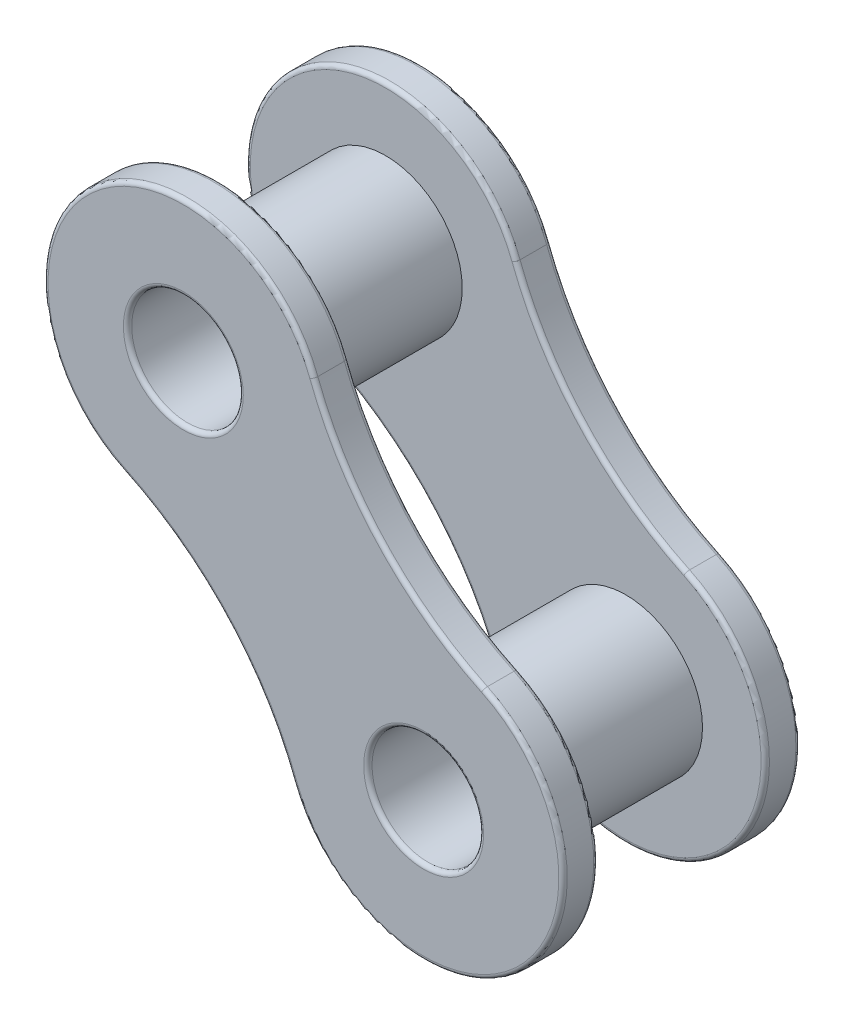
ISO-10303-21;
HEADER;
FILE_DESCRIPTION(('STEP AP214'),'2;1');
FILE_NAME('part.step','',(''),(''),'','','');
FILE_SCHEMA(('AUTOMOTIVE_DESIGN { 1 0 10303 214 1 1 1 1 }'));
ENDSEC;
DATA;
#1=APPLICATION_CONTEXT('core data for automotive mechanical design processes');
#2=APPLICATION_PROTOCOL_DEFINITION('international standard','automotive_design',2000,#1);
#3=PRODUCT_CONTEXT('',#1,'mechanical');
#4=PRODUCT('Part','Part','',(#3));
#5=PRODUCT_RELATED_PRODUCT_CATEGORY('part','',(#4));
#6=PRODUCT_DEFINITION_FORMATION('','',#4);
#7=PRODUCT_DEFINITION_CONTEXT('part definition',#1,'design');
#8=PRODUCT_DEFINITION('design','',#6,#7);
#9=PRODUCT_DEFINITION_SHAPE('','',#8);
#10=(LENGTH_UNIT() NAMED_UNIT(*) SI_UNIT(.MILLI.,.METRE.));
#11=(NAMED_UNIT(*) PLANE_ANGLE_UNIT() SI_UNIT($,.RADIAN.));
#12=(NAMED_UNIT(*) SI_UNIT($,.STERADIAN.) SOLID_ANGLE_UNIT());
#13=UNCERTAINTY_MEASURE_WITH_UNIT(LENGTH_MEASURE(1.E-05),#10,'distance_accuracy_value','');
#14=(GEOMETRIC_REPRESENTATION_CONTEXT(3) GLOBAL_UNCERTAINTY_ASSIGNED_CONTEXT((#13)) GLOBAL_UNIT_ASSIGNED_CONTEXT((#10,
#11,#12)) REPRESENTATION_CONTEXT('',''));
#15=CARTESIAN_POINT('',(0.,0.,0.));
#16=DIRECTION('',(0.,0.,1.));
#17=DIRECTION('',(1.,0.,0.));
#18=AXIS2_PLACEMENT_3D('',#15,#16,#17);
#19=CARTESIAN_POINT('',(30.571434610087,-17.7693676281133,-3.));
#20=DIRECTION('',(0.,0.,1.));
#21=DIRECTION('',(1.,0.,0.));
#22=AXIS2_PLACEMENT_3D('',#19,#20,#21);
#23=CYLINDRICAL_SURFACE('',#22,2.75);
#24=CARTESIAN_POINT('',(30.571434610087,-17.7693676281133,-3.));
#25=DIRECTION('',(0.,0.,1.));
#26=DIRECTION('',(1.,0.,0.));
#27=AXIS2_PLACEMENT_3D('',#24,#25,#26);
#28=CIRCLE('',#27,2.75);
#29=CARTESIAN_POINT('',(33.321434610087,-17.7693676281133,-3.));
#30=VERTEX_POINT('',#29);
#31=EDGE_CURVE('E325',#30,#30,#28,.T.);
#32=ORIENTED_EDGE('',*,*,#31,.T.);
#33=EDGE_LOOP('',(#32));
#34=FACE_BOUND('',#33,.T.);
#35=CARTESIAN_POINT('',(30.571434610087,-17.7693676281133,3.));
#36=DIRECTION('',(0.,0.,1.));
#37=DIRECTION('',(1.,0.,0.));
#38=AXIS2_PLACEMENT_3D('',#35,#36,#37);
#39=CIRCLE('',#38,2.75);
#40=CARTESIAN_POINT('',(33.321434610087,-17.7693676281133,3.));
#41=VERTEX_POINT('',#40);
#42=EDGE_CURVE('E334',#41,#41,#39,.T.);
#43=ORIENTED_EDGE('',*,*,#42,.F.);
#44=EDGE_LOOP('',(#43));
#45=FACE_BOUND('',#44,.T.);
#46=ADVANCED_FACE('F38',(#34,#45),#23,.T.);
#47=CARTESIAN_POINT('',(30.571434610087,-17.7693676281133,-3.));
#48=DIRECTION('',(0.,0.,1.));
#49=DIRECTION('',(1.,0.,0.));
#50=AXIS2_PLACEMENT_3D('',#47,#48,#49);
#51=CYLINDRICAL_SURFACE('',#50,2.);
#52=CARTESIAN_POINT('',(30.571434610087,-17.7693676281133,-4.1));
#53=DIRECTION('',(0.,0.,-1.));
#54=DIRECTION('',(-1.,0.,0.));
#55=AXIS2_PLACEMENT_3D('',#52,#53,#54);
#56=CIRCLE('',#55,2.);
#57=CARTESIAN_POINT('',(28.571434610087,-17.7693676281133,-4.1));
#58=VERTEX_POINT('',#57);
#59=EDGE_CURVE('E11',#58,#58,#56,.T.);
#60=ORIENTED_EDGE('',*,*,#59,.T.);
#61=EDGE_LOOP('',(#60));
#62=FACE_BOUND('',#61,.T.);
#63=CARTESIAN_POINT('',(30.571434610087,-17.7693676281133,4.1));
#64=DIRECTION('',(0.,0.,1.));
#65=DIRECTION('',(1.,0.,0.));
#66=AXIS2_PLACEMENT_3D('',#63,#64,#65);
#67=CIRCLE('',#66,2.);
#68=CARTESIAN_POINT('',(32.571434610087,-17.7693676281133,4.1));
#69=VERTEX_POINT('',#68);
#70=EDGE_CURVE('E47',#69,#69,#67,.T.);
#71=ORIENTED_EDGE('',*,*,#70,.T.);
#72=EDGE_LOOP('',(#71));
#73=FACE_BOUND('',#72,.T.);
#74=ADVANCED_FACE('F395',(#62,#73),#51,.F.);
#75=CARTESIAN_POINT('',(42.8259576243182,-19.4191147886434,4.25));
#76=DIRECTION('',(0.,0.,1.));
#77=DIRECTION('',(1.,0.,0.));
#78=AXIS2_PLACEMENT_3D('',#75,#76,#77);
#79=PLANE('',#78);
#80=CARTESIAN_POINT('',(23.2925043090767,-33.1322180691296,4.25));
#81=DIRECTION('',(0.,0.,1.));
#82=DIRECTION('',(1.,0.,0.));
#83=AXIS2_PLACEMENT_3D('',#80,#81,#82);
#84=CIRCLE('',#83,12.15);
#85=CARTESIAN_POINT('',(28.4947986124458,-22.1522984892268,4.25));
#86=VERTEX_POINT('',#85);
#87=CARTESIAN_POINT('',(34.6520311444618,-28.8213422792041,4.25));
#88=VERTEX_POINT('',#87);
#89=EDGE_CURVE('E218',#86,#88,#84,.F.);
#90=ORIENTED_EDGE('',*,*,#89,.T.);
#91=CARTESIAN_POINT('',(39.1864924738131,-27.1005400091516,4.25));
#92=DIRECTION('',(0.,0.,1.));
#93=DIRECTION('',(1.,0.,0.));
#94=AXIS2_PLACEMENT_3D('',#91,#92,#93);
#95=CIRCLE('',#94,4.85);
#96=CARTESIAN_POINT('',(41.2631284714542,-22.7176091480381,4.25));
#97=VERTEX_POINT('',#96);
#98=EDGE_CURVE('E220',#88,#97,#95,.T.);
#99=ORIENTED_EDGE('',*,*,#98,.T.);
#100=CARTESIAN_POINT('',(46.4654227748233,-11.7376895681353,4.25));
#101=DIRECTION('',(0.,0.,1.));
#102=DIRECTION('',(1.,0.,0.));
#103=AXIS2_PLACEMENT_3D('',#100,#101,#102);
#104=CIRCLE('',#103,12.15);
#105=CARTESIAN_POINT('',(35.1058959394382,-16.0485653580608,4.25));
#106=VERTEX_POINT('',#105);
#107=EDGE_CURVE('E214',#97,#106,#104,.F.);
#108=ORIENTED_EDGE('',*,*,#107,.T.);
#109=CARTESIAN_POINT('',(30.571434610087,-17.7693676281133,4.25));
#110=DIRECTION('',(0.,0.,1.));
#111=DIRECTION('',(1.,0.,0.));
#112=AXIS2_PLACEMENT_3D('',#109,#110,#111);
#113=CIRCLE('',#112,4.85);
#114=EDGE_CURVE('E216',#106,#86,#113,.T.);
#115=ORIENTED_EDGE('',*,*,#114,.T.);
#116=EDGE_LOOP('',(#90,#99,#108,#115));
#117=FACE_BOUND('',#116,.T.);
#118=CARTESIAN_POINT('',(39.1864924738131,-27.1005400091516,4.25));
#119=DIRECTION('',(0.,0.,1.));
#120=DIRECTION('',(1.,0.,0.));
#121=AXIS2_PLACEMENT_3D('',#118,#119,#120);
#122=CIRCLE('',#121,2.15);
#123=CARTESIAN_POINT('',(41.3364924738131,-27.1005400091516,4.25));
#124=VERTEX_POINT('',#123);
#125=EDGE_CURVE('E211',#124,#124,#122,.F.);
#126=ORIENTED_EDGE('',*,*,#125,.T.);
#127=EDGE_LOOP('',(#126));
#128=FACE_BOUND('',#127,.T.);
#129=CARTESIAN_POINT('',(30.571434610087,-17.7693676281133,4.25));
#130=DIRECTION('',(0.,0.,1.));
#131=DIRECTION('',(1.,0.,0.));
#132=AXIS2_PLACEMENT_3D('',#129,#130,#131);
#133=CIRCLE('',#132,2.15);
#134=CARTESIAN_POINT('',(32.721434610087,-17.7693676281133,4.25));
#135=VERTEX_POINT('',#134);
#136=EDGE_CURVE('E208',#135,#135,#133,.F.);
#137=ORIENTED_EDGE('',*,*,#136,.T.);
#138=EDGE_LOOP('',(#137));
#139=FACE_BOUND('',#138,.T.);
#140=ADVANCED_FACE('F401',(#117,#128,#139),#79,.T.);
#141=CARTESIAN_POINT('',(42.8259576243182,-19.4191147886434,3.));
#142=DIRECTION('',(0.,0.,1.));
#143=DIRECTION('',(1.,0.,0.));
#144=AXIS2_PLACEMENT_3D('',#141,#142,#143);
#145=PLANE('',#144);
#146=CARTESIAN_POINT('',(46.4654227748233,-11.7376895681353,3.));
#147=DIRECTION('',(0.,0.,1.));
#148=DIRECTION('',(1.,0.,0.));
#149=AXIS2_PLACEMENT_3D('',#146,#147,#148);
#150=CIRCLE('',#149,12.15);
#151=CARTESIAN_POINT('',(35.1058959394382,-16.0485653580608,3.));
#152=VERTEX_POINT('',#151);
#153=CARTESIAN_POINT('',(41.2631284714542,-22.7176091480381,3.));
#154=VERTEX_POINT('',#153);
#155=EDGE_CURVE('E237',#152,#154,#150,.T.);
#156=ORIENTED_EDGE('',*,*,#155,.T.);
#157=CARTESIAN_POINT('',(39.1864924738131,-27.1005400091516,3.));
#158=DIRECTION('',(0.,0.,1.));
#159=DIRECTION('',(1.,0.,0.));
#160=AXIS2_PLACEMENT_3D('',#157,#158,#159);
#161=CIRCLE('',#160,4.85);
#162=CARTESIAN_POINT('',(34.6520311444618,-28.8213422792041,3.));
#163=VERTEX_POINT('',#162);
#164=EDGE_CURVE('E242',#154,#163,#161,.F.);
#165=ORIENTED_EDGE('',*,*,#164,.T.);
#166=CARTESIAN_POINT('',(23.2925043090767,-33.1322180691296,3.));
#167=DIRECTION('',(0.,0.,1.));
#168=DIRECTION('',(1.,0.,0.));
#169=AXIS2_PLACEMENT_3D('',#166,#167,#168);
#170=CIRCLE('',#169,12.15);
#171=CARTESIAN_POINT('',(28.4947986124458,-22.1522984892268,3.));
#172=VERTEX_POINT('',#171);
#173=EDGE_CURVE('E62',#163,#172,#170,.T.);
#174=ORIENTED_EDGE('',*,*,#173,.T.);
#175=CARTESIAN_POINT('',(30.571434610087,-17.7693676281133,3.));
#176=DIRECTION('',(0.,0.,1.));
#177=DIRECTION('',(1.,0.,0.));
#178=AXIS2_PLACEMENT_3D('',#175,#176,#177);
#179=CIRCLE('',#178,4.85);
#180=EDGE_CURVE('E239',#172,#152,#179,.F.);
#181=ORIENTED_EDGE('',*,*,#180,.T.);
#182=EDGE_LOOP('',(#156,#165,#174,#181));
#183=FACE_BOUND('',#182,.T.);
#184=CARTESIAN_POINT('',(39.1864924738131,-27.1005400091516,3.));
#185=DIRECTION('',(0.,0.,1.));
#186=DIRECTION('',(1.,0.,0.));
#187=AXIS2_PLACEMENT_3D('',#184,#185,#186);
#188=CIRCLE('',#187,2.75);
#189=CARTESIAN_POINT('',(41.9364924738131,-27.1005400091516,3.));
#190=VERTEX_POINT('',#189);
#191=EDGE_CURVE('E320',#190,#190,#188,.T.);
#192=ORIENTED_EDGE('',*,*,#191,.T.);
#193=EDGE_LOOP('',(#192));
#194=FACE_BOUND('',#193,.T.);
#195=ORIENTED_EDGE('',*,*,#42,.T.);
#196=EDGE_LOOP('',(#195));
#197=FACE_BOUND('',#196,.T.);
#198=ADVANCED_FACE('F301',(#183,#194,#197),#145,.F.);
#199=CARTESIAN_POINT('',(46.4654227748233,-11.7376895681353,4.25));
#200=DIRECTION('',(0.,0.,-1.));
#201=DIRECTION('',(-1.,0.,0.));
#202=AXIS2_PLACEMENT_3D('',#199,#200,#201);
#203=CYLINDRICAL_SURFACE('',#202,12.);
#204=DIRECTION('',(0.,0.,-1.));
#205=VECTOR('',#204,1.);
#206=CARTESIAN_POINT('',(35.24613701148,-15.9953446692963,4.25));
#207=LINE('',#206,#205);
#208=CARTESIAN_POINT('',(35.24613701148,-15.9953446692963,4.1));
#209=VERTEX_POINT('',#208);
#210=CARTESIAN_POINT('',(35.24613701148,-15.9953446692963,3.15));
#211=VERTEX_POINT('',#210);
#212=EDGE_CURVE('E332',#209,#211,#207,.T.);
#213=ORIENTED_EDGE('',*,*,#212,.F.);
#214=CARTESIAN_POINT('',(46.4654227748233,-11.7376895681353,4.1));
#215=DIRECTION('',(0.,0.,1.));
#216=DIRECTION('',(1.,0.,0.));
#217=AXIS2_PLACEMENT_3D('',#214,#215,#216);
#218=CIRCLE('',#217,12.);
#219=CARTESIAN_POINT('',(41.3273543270514,-22.5820545853233,4.1));
#220=VERTEX_POINT('',#219);
#221=EDGE_CURVE('E250',#209,#220,#218,.T.);
#222=ORIENTED_EDGE('',*,*,#221,.T.);
#223=DIRECTION('',(0.,0.,-1.));
#224=VECTOR('',#223,1.);
#225=CARTESIAN_POINT('',(41.3273543270514,-22.5820545853233,4.25));
#226=LINE('',#225,#224);
#227=CARTESIAN_POINT('',(41.3273543270514,-22.5820545853233,3.15));
#228=VERTEX_POINT('',#227);
#229=EDGE_CURVE('E314',#220,#228,#226,.T.);
#230=ORIENTED_EDGE('',*,*,#229,.T.);
#231=CARTESIAN_POINT('',(46.4654227748233,-11.7376895681353,3.15));
#232=DIRECTION('',(0.,0.,1.));
#233=DIRECTION('',(1.,0.,0.));
#234=AXIS2_PLACEMENT_3D('',#231,#232,#233);
#235=CIRCLE('',#234,12.);
#236=EDGE_CURVE('E248',#228,#211,#235,.F.);
#237=ORIENTED_EDGE('',*,*,#236,.T.);
#238=EDGE_LOOP('',(#213,#222,#230,#237));
#239=FACE_BOUND('',#238,.T.);
#240=ADVANCED_FACE('F318',(#239),#203,.F.);
#241=CARTESIAN_POINT('',(30.571434610087,-17.7693676281133,4.25));
#242=DIRECTION('',(0.,0.,-1.));
#243=DIRECTION('',(-1.,0.,0.));
#244=AXIS2_PLACEMENT_3D('',#241,#242,#243);
#245=CYLINDRICAL_SURFACE('',#244,5.);
#246=DIRECTION('',(0.,0.,-1.));
#247=VECTOR('',#246,1.);
#248=CARTESIAN_POINT('',(28.4305727568486,-22.2878530519416,4.25));
#249=LINE('',#248,#247);
#250=CARTESIAN_POINT('',(28.4305727568486,-22.2878530519416,4.1));
#251=VERTEX_POINT('',#250);
#252=CARTESIAN_POINT('',(28.4305727568486,-22.2878530519416,3.15));
#253=VERTEX_POINT('',#252);
#254=EDGE_CURVE('E322',#251,#253,#249,.T.);
#255=ORIENTED_EDGE('',*,*,#254,.F.);
#256=CARTESIAN_POINT('',(30.571434610087,-17.7693676281133,4.1));
#257=DIRECTION('',(0.,0.,1.));
#258=DIRECTION('',(1.,0.,0.));
#259=AXIS2_PLACEMENT_3D('',#256,#257,#258);
#260=CIRCLE('',#259,5.);
#261=EDGE_CURVE('E235',#251,#209,#260,.F.);
#262=ORIENTED_EDGE('',*,*,#261,.T.);
#263=ORIENTED_EDGE('',*,*,#212,.T.);
#264=CARTESIAN_POINT('',(30.571434610087,-17.7693676281133,3.15));
#265=DIRECTION('',(0.,0.,1.));
#266=DIRECTION('',(1.,0.,0.));
#267=AXIS2_PLACEMENT_3D('',#264,#265,#266);
#268=CIRCLE('',#267,5.);
#269=EDGE_CURVE('E233',#211,#253,#268,.T.);
#270=ORIENTED_EDGE('',*,*,#269,.T.);
#271=EDGE_LOOP('',(#255,#262,#263,#270));
#272=FACE_BOUND('',#271,.T.);
#273=ADVANCED_FACE('F497',(#272),#245,.T.);
#274=CARTESIAN_POINT('',(23.2925043090767,-33.1322180691296,4.25));
#275=DIRECTION('',(0.,0.,-1.));
#276=DIRECTION('',(-1.,0.,0.));
#277=AXIS2_PLACEMENT_3D('',#274,#275,#276);
#278=CYLINDRICAL_SURFACE('',#277,12.);
#279=DIRECTION('',(0.,0.,-1.));
#280=VECTOR('',#279,1.);
#281=CARTESIAN_POINT('',(34.51179007242,-28.8745629679687,4.25));
#282=LINE('',#281,#280);
#283=CARTESIAN_POINT('',(34.51179007242,-28.8745629679687,4.1));
#284=VERTEX_POINT('',#283);
#285=CARTESIAN_POINT('',(34.51179007242,-28.8745629679687,3.15));
#286=VERTEX_POINT('',#285);
#287=EDGE_CURVE('E317',#284,#286,#282,.T.);
#288=ORIENTED_EDGE('',*,*,#287,.F.);
#289=CARTESIAN_POINT('',(23.2925043090767,-33.1322180691296,4.1));
#290=DIRECTION('',(0.,0.,1.));
#291=DIRECTION('',(1.,0.,0.));
#292=AXIS2_PLACEMENT_3D('',#289,#290,#291);
#293=CIRCLE('',#292,12.);
#294=EDGE_CURVE('E231',#284,#251,#293,.T.);
#295=ORIENTED_EDGE('',*,*,#294,.T.);
#296=ORIENTED_EDGE('',*,*,#254,.T.);
#297=CARTESIAN_POINT('',(23.2925043090767,-33.1322180691296,3.15));
#298=DIRECTION('',(0.,0.,1.));
#299=DIRECTION('',(1.,0.,0.));
#300=AXIS2_PLACEMENT_3D('',#297,#298,#299);
#301=CIRCLE('',#300,12.);
#302=EDGE_CURVE('E229',#253,#286,#301,.F.);
#303=ORIENTED_EDGE('',*,*,#302,.T.);
#304=EDGE_LOOP('',(#288,#295,#296,#303));
#305=FACE_BOUND('',#304,.T.);
#306=ADVANCED_FACE('F494',(#305),#278,.F.);
#307=CARTESIAN_POINT('',(39.1864924738131,-27.1005400091516,4.25));
#308=DIRECTION('',(0.,0.,-1.));
#309=DIRECTION('',(-1.,0.,0.));
#310=AXIS2_PLACEMENT_3D('',#307,#308,#309);
#311=CYLINDRICAL_SURFACE('',#310,5.);
#312=ORIENTED_EDGE('',*,*,#229,.F.);
#313=CARTESIAN_POINT('',(39.1864924738131,-27.1005400091516,4.1));
#314=DIRECTION('',(0.,0.,1.));
#315=DIRECTION('',(1.,0.,0.));
#316=AXIS2_PLACEMENT_3D('',#313,#314,#315);
#317=CIRCLE('',#316,5.);
#318=EDGE_CURVE('E226',#220,#284,#317,.F.);
#319=ORIENTED_EDGE('',*,*,#318,.T.);
#320=ORIENTED_EDGE('',*,*,#287,.T.);
#321=CARTESIAN_POINT('',(39.1864924738131,-27.1005400091516,3.15));
#322=DIRECTION('',(0.,0.,1.));
#323=DIRECTION('',(1.,0.,0.));
#324=AXIS2_PLACEMENT_3D('',#321,#322,#323);
#325=CIRCLE('',#324,5.);
#326=EDGE_CURVE('E223',#286,#228,#325,.T.);
#327=ORIENTED_EDGE('',*,*,#326,.T.);
#328=EDGE_LOOP('',(#312,#319,#320,#327));
#329=FACE_BOUND('',#328,.T.);
#330=ADVANCED_FACE('F313',(#329),#311,.T.);
#331=CARTESIAN_POINT('',(39.1864924738131,-27.1005400091516,4.25));
#332=DIRECTION('',(0.,0.,-1.));
#333=DIRECTION('',(-1.,0.,0.));
#334=AXIS2_PLACEMENT_3D('',#331,#332,#333);
#335=CYLINDRICAL_SURFACE('',#334,2.);
#336=CARTESIAN_POINT('',(39.1864924738131,-27.1005400091516,-4.1));
#337=DIRECTION('',(0.,0.,-1.));
#338=DIRECTION('',(-1.,0.,0.));
#339=AXIS2_PLACEMENT_3D('',#336,#337,#338);
#340=CIRCLE('',#339,2.);
#341=CARTESIAN_POINT('',(37.1864924738131,-27.1005400091516,-4.1));
#342=VERTEX_POINT('',#341);
#343=EDGE_CURVE('E255',#342,#342,#340,.T.);
#344=ORIENTED_EDGE('',*,*,#343,.T.);
#345=EDGE_LOOP('',(#344));
#346=FACE_BOUND('',#345,.T.);
#347=CARTESIAN_POINT('',(39.1864924738131,-27.1005400091516,4.1));
#348=DIRECTION('',(0.,0.,1.));
#349=DIRECTION('',(1.,0.,0.));
#350=AXIS2_PLACEMENT_3D('',#347,#348,#349);
#351=CIRCLE('',#350,2.);
#352=CARTESIAN_POINT('',(41.1864924738131,-27.1005400091516,4.1));
#353=VERTEX_POINT('',#352);
#354=EDGE_CURVE('E252',#353,#353,#351,.T.);
#355=ORIENTED_EDGE('',*,*,#354,.T.);
#356=EDGE_LOOP('',(#355));
#357=FACE_BOUND('',#356,.T.);
#358=ADVANCED_FACE('F489',(#346,#357),#335,.F.);
#359=CARTESIAN_POINT('',(39.1864924738131,-27.1005400091516,-3.));
#360=DIRECTION('',(0.,0.,1.));
#361=DIRECTION('',(1.,0.,0.));
#362=AXIS2_PLACEMENT_3D('',#359,#360,#361);
#363=CYLINDRICAL_SURFACE('',#362,2.75);
#364=CARTESIAN_POINT('',(39.1864924738131,-27.1005400091516,-3.));
#365=DIRECTION('',(0.,0.,1.));
#366=DIRECTION('',(1.,0.,0.));
#367=AXIS2_PLACEMENT_3D('',#364,#365,#366);
#368=CIRCLE('',#367,2.75);
#369=CARTESIAN_POINT('',(41.9364924738131,-27.1005400091516,-3.));
#370=VERTEX_POINT('',#369);
#371=EDGE_CURVE('E328',#370,#370,#368,.T.);
#372=ORIENTED_EDGE('',*,*,#371,.T.);
#373=EDGE_LOOP('',(#372));
#374=FACE_BOUND('',#373,.T.);
#375=ORIENTED_EDGE('',*,*,#191,.F.);
#376=EDGE_LOOP('',(#375));
#377=FACE_BOUND('',#376,.T.);
#378=ADVANCED_FACE('F376',(#374,#377),#363,.T.);
#379=CARTESIAN_POINT('',(38.5184286924551,-14.7535285981243,-4.25));
#380=DIRECTION('',(0.,0.,-1.));
#381=DIRECTION('',(-1.,0.,0.));
#382=AXIS2_PLACEMENT_3D('',#379,#380,#381);
#383=PLANE('',#382);
#384=CARTESIAN_POINT('',(23.2925043090767,-33.1322180691296,-4.25));
#385=DIRECTION('',(0.,0.,-1.));
#386=DIRECTION('',(-1.,0.,0.));
#387=AXIS2_PLACEMENT_3D('',#384,#385,#386);
#388=CIRCLE('',#387,12.15);
#389=CARTESIAN_POINT('',(34.6520311444618,-28.8213422792042,-4.25));
#390=VERTEX_POINT('',#389);
#391=CARTESIAN_POINT('',(28.4947986124458,-22.1522984892268,-4.25));
#392=VERTEX_POINT('',#391);
#393=EDGE_CURVE('E181',#390,#392,#388,.F.);
#394=ORIENTED_EDGE('',*,*,#393,.T.);
#395=CARTESIAN_POINT('',(30.571434610087,-17.7693676281133,-4.25));
#396=DIRECTION('',(0.,0.,-1.));
#397=DIRECTION('',(-1.,0.,0.));
#398=AXIS2_PLACEMENT_3D('',#395,#396,#397);
#399=CIRCLE('',#398,4.85);
#400=CARTESIAN_POINT('',(35.1058959394382,-16.0485653580608,-4.25));
#401=VERTEX_POINT('',#400);
#402=EDGE_CURVE('E160',#392,#401,#399,.T.);
#403=ORIENTED_EDGE('',*,*,#402,.T.);
#404=CARTESIAN_POINT('',(46.4654227748233,-11.7376895681353,-4.25));
#405=DIRECTION('',(0.,0.,-1.));
#406=DIRECTION('',(-1.,0.,0.));
#407=AXIS2_PLACEMENT_3D('',#404,#405,#406);
#408=CIRCLE('',#407,12.15);
#409=CARTESIAN_POINT('',(41.2631284714542,-22.7176091480381,-4.25));
#410=VERTEX_POINT('',#409);
#411=EDGE_CURVE('E169',#401,#410,#408,.F.);
#412=ORIENTED_EDGE('',*,*,#411,.T.);
#413=CARTESIAN_POINT('',(39.1864924738131,-27.1005400091516,-4.25));
#414=DIRECTION('',(0.,0.,-1.));
#415=DIRECTION('',(-1.,0.,0.));
#416=AXIS2_PLACEMENT_3D('',#413,#414,#415);
#417=CIRCLE('',#416,4.85);
#418=EDGE_CURVE('E175',#410,#390,#417,.T.);
#419=ORIENTED_EDGE('',*,*,#418,.T.);
#420=EDGE_LOOP('',(#394,#403,#412,#419));
#421=FACE_BOUND('',#420,.T.);
#422=CARTESIAN_POINT('',(39.1864924738131,-27.1005400091516,-4.25));
#423=DIRECTION('',(0.,0.,-1.));
#424=DIRECTION('',(-1.,0.,0.));
#425=AXIS2_PLACEMENT_3D('',#422,#423,#424);
#426=CIRCLE('',#425,2.15);
#427=CARTESIAN_POINT('',(37.0364924738131,-27.1005400091516,-4.25));
#428=VERTEX_POINT('',#427);
#429=EDGE_CURVE('E176',#428,#428,#426,.F.);
#430=ORIENTED_EDGE('',*,*,#429,.T.);
#431=EDGE_LOOP('',(#430));
#432=FACE_BOUND('',#431,.T.);
#433=CARTESIAN_POINT('',(30.571434610087,-17.7693676281133,-4.25));
#434=DIRECTION('',(0.,0.,-1.));
#435=DIRECTION('',(-1.,0.,0.));
#436=AXIS2_PLACEMENT_3D('',#433,#434,#435);
#437=CIRCLE('',#436,2.15);
#438=CARTESIAN_POINT('',(28.421434610087,-17.7693676281133,-4.25));
#439=VERTEX_POINT('',#438);
#440=EDGE_CURVE('E337',#439,#439,#437,.F.);
#441=ORIENTED_EDGE('',*,*,#440,.T.);
#442=EDGE_LOOP('',(#441));
#443=FACE_BOUND('',#442,.T.);
#444=ADVANCED_FACE('F178',(#421,#432,#443),#383,.T.);
#445=CARTESIAN_POINT('',(38.5184286924551,-14.7535285981243,-3.));
#446=DIRECTION('',(0.,0.,-1.));
#447=DIRECTION('',(-1.,0.,0.));
#448=AXIS2_PLACEMENT_3D('',#445,#446,#447);
#449=PLANE('',#448);
#450=CARTESIAN_POINT('',(46.4654227748233,-11.7376895681353,-3.));
#451=DIRECTION('',(0.,0.,-1.));
#452=DIRECTION('',(-1.,0.,0.));
#453=AXIS2_PLACEMENT_3D('',#450,#451,#452);
#454=CIRCLE('',#453,12.15);
#455=CARTESIAN_POINT('',(41.2631284714542,-22.7176091480381,-3.));
#456=VERTEX_POINT('',#455);
#457=CARTESIAN_POINT('',(35.1058959394382,-16.0485653580608,-3.));
#458=VERTEX_POINT('',#457);
#459=EDGE_CURVE('E199',#456,#458,#454,.T.);
#460=ORIENTED_EDGE('',*,*,#459,.T.);
#461=CARTESIAN_POINT('',(30.571434610087,-17.7693676281133,-3.));
#462=DIRECTION('',(0.,0.,-1.));
#463=DIRECTION('',(-1.,0.,0.));
#464=AXIS2_PLACEMENT_3D('',#461,#462,#463);
#465=CIRCLE('',#464,4.85);
#466=CARTESIAN_POINT('',(28.4947986124458,-22.1522984892268,-3.));
#467=VERTEX_POINT('',#466);
#468=EDGE_CURVE('E205',#458,#467,#465,.F.);
#469=ORIENTED_EDGE('',*,*,#468,.T.);
#470=CARTESIAN_POINT('',(23.2925043090767,-33.1322180691296,-3.));
#471=DIRECTION('',(0.,0.,-1.));
#472=DIRECTION('',(-1.,0.,0.));
#473=AXIS2_PLACEMENT_3D('',#470,#471,#472);
#474=CIRCLE('',#473,12.15);
#475=CARTESIAN_POINT('',(34.6520311444618,-28.8213422792042,-3.));
#476=VERTEX_POINT('',#475);
#477=EDGE_CURVE('E203',#467,#476,#474,.T.);
#478=ORIENTED_EDGE('',*,*,#477,.T.);
#479=CARTESIAN_POINT('',(39.1864924738131,-27.1005400091516,-3.));
#480=DIRECTION('',(0.,0.,-1.));
#481=DIRECTION('',(-1.,0.,0.));
#482=AXIS2_PLACEMENT_3D('',#479,#480,#481);
#483=CIRCLE('',#482,4.85);
#484=EDGE_CURVE('E201',#476,#456,#483,.F.);
#485=ORIENTED_EDGE('',*,*,#484,.T.);
#486=EDGE_LOOP('',(#460,#469,#478,#485));
#487=FACE_BOUND('',#486,.T.);
#488=ORIENTED_EDGE('',*,*,#31,.F.);
#489=EDGE_LOOP('',(#488));
#490=FACE_BOUND('',#489,.T.);
#491=ORIENTED_EDGE('',*,*,#371,.F.);
#492=EDGE_LOOP('',(#491));
#493=FACE_BOUND('',#492,.T.);
#494=ADVANCED_FACE('F379',(#487,#490,#493),#449,.F.);
#495=CARTESIAN_POINT('',(46.4654227748233,-11.7376895681353,-4.25));
#496=DIRECTION('',(0.,0.,1.));
#497=DIRECTION('',(1.,0.,0.));
#498=AXIS2_PLACEMENT_3D('',#495,#496,#497);
#499=CYLINDRICAL_SURFACE('',#498,12.);
#500=DIRECTION('',(0.,0.,1.));
#501=VECTOR('',#500,1.);
#502=CARTESIAN_POINT('',(41.3273543270514,-22.5820545853233,-4.25));
#503=LINE('',#502,#501);
#504=CARTESIAN_POINT('',(41.3273543270514,-22.5820545853233,-4.1));
#505=VERTEX_POINT('',#504);
#506=CARTESIAN_POINT('',(41.3273543270514,-22.5820545853233,-3.15));
#507=VERTEX_POINT('',#506);
#508=EDGE_CURVE('E365',#505,#507,#503,.T.);
#509=ORIENTED_EDGE('',*,*,#508,.F.);
#510=CARTESIAN_POINT('',(46.4654227748233,-11.7376895681353,-4.1));
#511=DIRECTION('',(0.,0.,-1.));
#512=DIRECTION('',(-1.,0.,0.));
#513=AXIS2_PLACEMENT_3D('',#510,#511,#512);
#514=CIRCLE('',#513,12.);
#515=CARTESIAN_POINT('',(35.24613701148,-15.9953446692963,-4.1));
#516=VERTEX_POINT('',#515);
#517=EDGE_CURVE('E246',#505,#516,#514,.T.);
#518=ORIENTED_EDGE('',*,*,#517,.T.);
#519=DIRECTION('',(0.,0.,1.));
#520=VECTOR('',#519,1.);
#521=CARTESIAN_POINT('',(35.24613701148,-15.9953446692963,-4.25));
#522=LINE('',#521,#520);
#523=CARTESIAN_POINT('',(35.24613701148,-15.9953446692963,-3.15));
#524=VERTEX_POINT('',#523);
#525=EDGE_CURVE('E265',#516,#524,#522,.T.);
#526=ORIENTED_EDGE('',*,*,#525,.T.);
#527=CARTESIAN_POINT('',(46.4654227748233,-11.7376895681353,-3.15));
#528=DIRECTION('',(0.,0.,-1.));
#529=DIRECTION('',(-1.,0.,0.));
#530=AXIS2_PLACEMENT_3D('',#527,#528,#529);
#531=CIRCLE('',#530,12.);
#532=EDGE_CURVE('E244',#524,#507,#531,.F.);
#533=ORIENTED_EDGE('',*,*,#532,.T.);
#534=EDGE_LOOP('',(#509,#518,#526,#533));
#535=FACE_BOUND('',#534,.T.);
#536=ADVANCED_FACE('F381',(#535),#499,.F.);
#537=CARTESIAN_POINT('',(39.1864924738131,-27.1005400091516,-4.25));
#538=DIRECTION('',(0.,0.,1.));
#539=DIRECTION('',(1.,0.,0.));
#540=AXIS2_PLACEMENT_3D('',#537,#538,#539);
#541=CYLINDRICAL_SURFACE('',#540,5.);
#542=DIRECTION('',(0.,0.,1.));
#543=VECTOR('',#542,1.);
#544=CARTESIAN_POINT('',(34.51179007242,-28.8745629679687,-4.25));
#545=LINE('',#544,#543);
#546=CARTESIAN_POINT('',(34.51179007242,-28.8745629679687,-4.1));
#547=VERTEX_POINT('',#546);
#548=CARTESIAN_POINT('',(34.51179007242,-28.8745629679687,-3.15));
#549=VERTEX_POINT('',#548);
#550=EDGE_CURVE('E363',#547,#549,#545,.T.);
#551=ORIENTED_EDGE('',*,*,#550,.F.);
#552=CARTESIAN_POINT('',(39.1864924738131,-27.1005400091516,-4.1));
#553=DIRECTION('',(0.,0.,-1.));
#554=DIRECTION('',(-1.,0.,0.));
#555=AXIS2_PLACEMENT_3D('',#552,#553,#554);
#556=CIRCLE('',#555,5.);
#557=EDGE_CURVE('E197',#547,#505,#556,.F.);
#558=ORIENTED_EDGE('',*,*,#557,.T.);
#559=ORIENTED_EDGE('',*,*,#508,.T.);
#560=CARTESIAN_POINT('',(39.1864924738131,-27.1005400091516,-3.15));
#561=DIRECTION('',(0.,0.,-1.));
#562=DIRECTION('',(-1.,0.,0.));
#563=AXIS2_PLACEMENT_3D('',#560,#561,#562);
#564=CIRCLE('',#563,5.);
#565=EDGE_CURVE('E195',#507,#549,#564,.T.);
#566=ORIENTED_EDGE('',*,*,#565,.T.);
#567=EDGE_LOOP('',(#551,#558,#559,#566));
#568=FACE_BOUND('',#567,.T.);
#569=ADVANCED_FACE('F388',(#568),#541,.T.);
#570=CARTESIAN_POINT('',(23.2925043090767,-33.1322180691296,-4.25));
#571=DIRECTION('',(0.,0.,1.));
#572=DIRECTION('',(1.,0.,0.));
#573=AXIS2_PLACEMENT_3D('',#570,#571,#572);
#574=CYLINDRICAL_SURFACE('',#573,12.);
#575=DIRECTION('',(0.,0.,1.));
#576=VECTOR('',#575,1.);
#577=CARTESIAN_POINT('',(28.4305727568486,-22.2878530519417,-4.25));
#578=LINE('',#577,#576);
#579=CARTESIAN_POINT('',(28.4305727568486,-22.2878530519417,-4.1));
#580=VERTEX_POINT('',#579);
#581=CARTESIAN_POINT('',(28.4305727568486,-22.2878530519417,-3.15));
#582=VERTEX_POINT('',#581);
#583=EDGE_CURVE('E358',#580,#582,#578,.T.);
#584=ORIENTED_EDGE('',*,*,#583,.F.);
#585=CARTESIAN_POINT('',(23.2925043090767,-33.1322180691296,-4.1));
#586=DIRECTION('',(0.,0.,-1.));
#587=DIRECTION('',(-1.,0.,0.));
#588=AXIS2_PLACEMENT_3D('',#585,#586,#587);
#589=CIRCLE('',#588,12.);
#590=EDGE_CURVE('E193',#580,#547,#589,.T.);
#591=ORIENTED_EDGE('',*,*,#590,.T.);
#592=ORIENTED_EDGE('',*,*,#550,.T.);
#593=CARTESIAN_POINT('',(23.2925043090767,-33.1322180691296,-3.15));
#594=DIRECTION('',(0.,0.,-1.));
#595=DIRECTION('',(-1.,0.,0.));
#596=AXIS2_PLACEMENT_3D('',#593,#594,#595);
#597=CIRCLE('',#596,12.);
#598=EDGE_CURVE('E191',#549,#582,#597,.F.);
#599=ORIENTED_EDGE('',*,*,#598,.T.);
#600=EDGE_LOOP('',(#584,#591,#592,#599));
#601=FACE_BOUND('',#600,.T.);
#602=ADVANCED_FACE('F361',(#601),#574,.F.);
#603=CARTESIAN_POINT('',(30.571434610087,-17.7693676281133,-4.25));
#604=DIRECTION('',(0.,0.,1.));
#605=DIRECTION('',(1.,0.,0.));
#606=AXIS2_PLACEMENT_3D('',#603,#604,#605);
#607=CYLINDRICAL_SURFACE('',#606,5.);
#608=ORIENTED_EDGE('',*,*,#525,.F.);
#609=CARTESIAN_POINT('',(30.571434610087,-17.7693676281133,-4.1));
#610=DIRECTION('',(0.,0.,-1.));
#611=DIRECTION('',(-1.,0.,0.));
#612=AXIS2_PLACEMENT_3D('',#609,#610,#611);
#613=CIRCLE('',#612,5.);
#614=EDGE_CURVE('E162',#516,#580,#613,.F.);
#615=ORIENTED_EDGE('',*,*,#614,.T.);
#616=ORIENTED_EDGE('',*,*,#583,.T.);
#617=CARTESIAN_POINT('',(30.571434610087,-17.7693676281133,-3.15));
#618=DIRECTION('',(0.,0.,-1.));
#619=DIRECTION('',(-1.,0.,0.));
#620=AXIS2_PLACEMENT_3D('',#617,#618,#619);
#621=CIRCLE('',#620,5.);
#622=EDGE_CURVE('E183',#582,#524,#621,.T.);
#623=ORIENTED_EDGE('',*,*,#622,.T.);
#624=EDGE_LOOP('',(#608,#615,#616,#623));
#625=FACE_BOUND('',#624,.T.);
#626=ADVANCED_FACE('F357',(#625),#607,.T.);
#627=CARTESIAN_POINT('',(39.1864924738131,-27.1005400091516,-4.1));
#628=DIRECTION('',(0.,0.,-1.));
#629=DIRECTION('',(-1.,0.,0.));
#630=AXIS2_PLACEMENT_3D('',#627,#628,#629);
#631=TOROIDAL_SURFACE('',#630,4.85,0.15);
#632=CARTESIAN_POINT('',(41.2631284714542,-22.7176091480381,-4.1));
#633=DIRECTION('',(-0.903697084765664,0.428172370647664,0.));
#634=DIRECTION('',(-0.428172370647664,-0.903697084765664,0.));
#635=AXIS2_PLACEMENT_3D('',#632,#633,#634);
#636=CIRCLE('',#635,0.15);
#637=EDGE_CURVE('E172',#505,#410,#636,.T.);
#638=ORIENTED_EDGE('',*,*,#637,.F.);
#639=ORIENTED_EDGE('',*,*,#557,.F.);
#640=CARTESIAN_POINT('',(34.6520311444618,-28.8213422792042,-4.1));
#641=DIRECTION('',(-0.354804591763395,0.934940480278617,0.));
#642=DIRECTION('',(-0.934940480278617,-0.354804591763395,0.));
#643=AXIS2_PLACEMENT_3D('',#640,#641,#642);
#644=CIRCLE('',#643,0.15);
#645=EDGE_CURVE('E262',#390,#547,#644,.T.);
#646=ORIENTED_EDGE('',*,*,#645,.F.);
#647=ORIENTED_EDGE('',*,*,#418,.F.);
#648=EDGE_LOOP('',(#638,#639,#646,#647));
#649=FACE_BOUND('',#648,.T.);
#650=ADVANCED_FACE('F346',(#649),#631,.T.);
#651=CARTESIAN_POINT('',(23.2925043090767,-33.1322180691296,-4.1));
#652=DIRECTION('',(0.,0.,-1.));
#653=DIRECTION('',(-1.,0.,0.));
#654=AXIS2_PLACEMENT_3D('',#651,#652,#653);
#655=TOROIDAL_SURFACE('',#654,12.15,0.15);
#656=ORIENTED_EDGE('',*,*,#645,.T.);
#657=ORIENTED_EDGE('',*,*,#590,.F.);
#658=CARTESIAN_POINT('',(28.4947986124458,-22.1522984892268,-4.1));
#659=DIRECTION('',(-0.903697084765664,0.428172370647664,0.));
#660=DIRECTION('',(-0.428172370647664,-0.903697084765664,0.));
#661=AXIS2_PLACEMENT_3D('',#658,#659,#660);
#662=CIRCLE('',#661,0.15);
#663=EDGE_CURVE('E165',#392,#580,#662,.T.);
#664=ORIENTED_EDGE('',*,*,#663,.F.);
#665=ORIENTED_EDGE('',*,*,#393,.F.);
#666=EDGE_LOOP('',(#656,#657,#664,#665));
#667=FACE_BOUND('',#666,.T.);
#668=ADVANCED_FACE('F349',(#667),#655,.T.);
#669=CARTESIAN_POINT('',(46.4654227748233,-11.7376895681353,-4.1));
#670=DIRECTION('',(0.,0.,-1.));
#671=DIRECTION('',(-1.,0.,0.));
#672=AXIS2_PLACEMENT_3D('',#669,#670,#671);
#673=TOROIDAL_SURFACE('',#672,12.15,0.15);
#674=ORIENTED_EDGE('',*,*,#637,.T.);
#675=ORIENTED_EDGE('',*,*,#411,.F.);
#676=CARTESIAN_POINT('',(35.1058959394382,-16.0485653580608,-4.1));
#677=DIRECTION('',(-0.354804591763431,0.934940480278603,0.));
#678=DIRECTION('',(-0.934940480278603,-0.354804591763431,0.));
#679=AXIS2_PLACEMENT_3D('',#676,#677,#678);
#680=CIRCLE('',#679,0.15);
#681=EDGE_CURVE('E156',#516,#401,#680,.T.);
#682=ORIENTED_EDGE('',*,*,#681,.F.);
#683=ORIENTED_EDGE('',*,*,#517,.F.);
#684=EDGE_LOOP('',(#674,#675,#682,#683));
#685=FACE_BOUND('',#684,.T.);
#686=ADVANCED_FACE('F170',(#685),#673,.T.);
#687=CARTESIAN_POINT('',(30.571434610087,-17.7693676281133,-4.1));
#688=DIRECTION('',(0.,0.,-1.));
#689=DIRECTION('',(-1.,0.,0.));
#690=AXIS2_PLACEMENT_3D('',#687,#688,#689);
#691=TOROIDAL_SURFACE('',#690,4.85,0.15);
#692=ORIENTED_EDGE('',*,*,#663,.T.);
#693=ORIENTED_EDGE('',*,*,#614,.F.);
#694=ORIENTED_EDGE('',*,*,#681,.T.);
#695=ORIENTED_EDGE('',*,*,#402,.F.);
#696=EDGE_LOOP('',(#692,#693,#694,#695));
#697=FACE_BOUND('',#696,.T.);
#698=ADVANCED_FACE('F158',(#697),#691,.T.);
#699=CARTESIAN_POINT('',(39.1864924738131,-27.1005400091516,-3.15));
#700=DIRECTION('',(0.,0.,-1.));
#701=DIRECTION('',(-1.,0.,0.));
#702=AXIS2_PLACEMENT_3D('',#699,#700,#701);
#703=TOROIDAL_SURFACE('',#702,4.85,0.15);
#704=CARTESIAN_POINT('',(41.2631284714542,-22.7176091480381,-3.15));
#705=DIRECTION('',(-0.903697084765664,0.428172370647664,0.));
#706=DIRECTION('',(-0.428172370647664,-0.903697084765664,0.));
#707=AXIS2_PLACEMENT_3D('',#704,#705,#706);
#708=CIRCLE('',#707,0.15);
#709=EDGE_CURVE('E271',#456,#507,#708,.T.);
#710=ORIENTED_EDGE('',*,*,#709,.F.);
#711=ORIENTED_EDGE('',*,*,#484,.F.);
#712=CARTESIAN_POINT('',(34.6520311444618,-28.8213422792041,-3.15));
#713=DIRECTION('',(-0.354804591763431,0.934940480278603,0.));
#714=DIRECTION('',(-0.934940480278603,-0.354804591763431,0.));
#715=AXIS2_PLACEMENT_3D('',#712,#713,#714);
#716=CIRCLE('',#715,0.15);
#717=EDGE_CURVE('E166',#549,#476,#716,.T.);
#718=ORIENTED_EDGE('',*,*,#717,.F.);
#719=ORIENTED_EDGE('',*,*,#565,.F.);
#720=EDGE_LOOP('',(#710,#711,#718,#719));
#721=FACE_BOUND('',#720,.T.);
#722=ADVANCED_FACE('F409',(#721),#703,.T.);
#723=CARTESIAN_POINT('',(23.2925043090767,-33.1322180691296,-3.15));
#724=DIRECTION('',(0.,0.,-1.));
#725=DIRECTION('',(-1.,0.,0.));
#726=AXIS2_PLACEMENT_3D('',#723,#724,#725);
#727=TOROIDAL_SURFACE('',#726,12.15,0.15);
#728=ORIENTED_EDGE('',*,*,#717,.T.);
#729=ORIENTED_EDGE('',*,*,#477,.F.);
#730=CARTESIAN_POINT('',(28.4947986124458,-22.1522984892268,-3.15));
#731=DIRECTION('',(-0.903697084765664,0.428172370647664,0.));
#732=DIRECTION('',(-0.428172370647664,-0.903697084765664,0.));
#733=AXIS2_PLACEMENT_3D('',#730,#731,#732);
#734=CIRCLE('',#733,0.15);
#735=EDGE_CURVE('E268',#582,#467,#734,.T.);
#736=ORIENTED_EDGE('',*,*,#735,.F.);
#737=ORIENTED_EDGE('',*,*,#598,.F.);
#738=EDGE_LOOP('',(#728,#729,#736,#737));
#739=FACE_BOUND('',#738,.T.);
#740=ADVANCED_FACE('F424',(#739),#727,.T.);
#741=CARTESIAN_POINT('',(46.4654227748233,-11.7376895681353,-3.15));
#742=DIRECTION('',(0.,0.,-1.));
#743=DIRECTION('',(-1.,0.,0.));
#744=AXIS2_PLACEMENT_3D('',#741,#742,#743);
#745=TOROIDAL_SURFACE('',#744,12.15,0.15);
#746=ORIENTED_EDGE('',*,*,#709,.T.);
#747=ORIENTED_EDGE('',*,*,#532,.F.);
#748=CARTESIAN_POINT('',(35.1058959394382,-16.0485653580608,-3.15));
#749=DIRECTION('',(-0.354804591763415,0.934940480278609,0.));
#750=DIRECTION('',(-0.934940480278609,-0.354804591763415,0.));
#751=AXIS2_PLACEMENT_3D('',#748,#749,#750);
#752=CIRCLE('',#751,0.15);
#753=EDGE_CURVE('E266',#458,#524,#752,.T.);
#754=ORIENTED_EDGE('',*,*,#753,.F.);
#755=ORIENTED_EDGE('',*,*,#459,.F.);
#756=EDGE_LOOP('',(#746,#747,#754,#755));
#757=FACE_BOUND('',#756,.T.);
#758=ADVANCED_FACE('F420',(#757),#745,.T.);
#759=CARTESIAN_POINT('',(30.571434610087,-17.7693676281133,-3.15));
#760=DIRECTION('',(0.,0.,-1.));
#761=DIRECTION('',(-1.,0.,0.));
#762=AXIS2_PLACEMENT_3D('',#759,#760,#761);
#763=TOROIDAL_SURFACE('',#762,4.85,0.15);
#764=ORIENTED_EDGE('',*,*,#735,.T.);
#765=ORIENTED_EDGE('',*,*,#468,.F.);
#766=ORIENTED_EDGE('',*,*,#753,.T.);
#767=ORIENTED_EDGE('',*,*,#622,.F.);
#768=EDGE_LOOP('',(#764,#765,#766,#767));
#769=FACE_BOUND('',#768,.T.);
#770=ADVANCED_FACE('F416',(#769),#763,.T.);
#771=CARTESIAN_POINT('',(30.571434610087,-17.7693676281133,4.1));
#772=DIRECTION('',(0.,0.,1.));
#773=DIRECTION('',(1.,0.,0.));
#774=AXIS2_PLACEMENT_3D('',#771,#772,#773);
#775=TOROIDAL_SURFACE('',#774,4.85,0.15);
#776=CARTESIAN_POINT('',(35.1058959394382,-16.0485653580608,4.1));
#777=DIRECTION('',(0.35480459176341,-0.934940480278611,0.));
#778=DIRECTION('',(0.934940480278611,0.35480459176341,0.));
#779=AXIS2_PLACEMENT_3D('',#776,#777,#778);
#780=CIRCLE('',#779,0.15);
#781=EDGE_CURVE('E280',#209,#106,#780,.T.);
#782=ORIENTED_EDGE('',*,*,#781,.F.);
#783=ORIENTED_EDGE('',*,*,#261,.F.);
#784=CARTESIAN_POINT('',(28.4947986124458,-22.1522984892268,4.1));
#785=DIRECTION('',(0.903697084765664,-0.428172370647664,0.));
#786=DIRECTION('',(0.428172370647664,0.903697084765664,0.));
#787=AXIS2_PLACEMENT_3D('',#784,#785,#786);
#788=CIRCLE('',#787,0.15);
#789=EDGE_CURVE('E269',#86,#251,#788,.T.);
#790=ORIENTED_EDGE('',*,*,#789,.F.);
#791=ORIENTED_EDGE('',*,*,#114,.F.);
#792=EDGE_LOOP('',(#782,#783,#790,#791));
#793=FACE_BOUND('',#792,.T.);
#794=ADVANCED_FACE('F419',(#793),#775,.T.);
#795=CARTESIAN_POINT('',(23.2925043090767,-33.1322180691296,4.1));
#796=DIRECTION('',(0.,0.,1.));
#797=DIRECTION('',(1.,0.,0.));
#798=AXIS2_PLACEMENT_3D('',#795,#796,#797);
#799=TOROIDAL_SURFACE('',#798,12.15,0.15);
#800=ORIENTED_EDGE('',*,*,#789,.T.);
#801=ORIENTED_EDGE('',*,*,#294,.F.);
#802=CARTESIAN_POINT('',(34.6520311444618,-28.8213422792041,4.1));
#803=DIRECTION('',(0.354804591763431,-0.934940480278603,0.));
#804=DIRECTION('',(0.934940480278603,0.354804591763431,0.));
#805=AXIS2_PLACEMENT_3D('',#802,#803,#804);
#806=CIRCLE('',#805,0.15);
#807=EDGE_CURVE('E278',#88,#284,#806,.T.);
#808=ORIENTED_EDGE('',*,*,#807,.F.);
#809=ORIENTED_EDGE('',*,*,#89,.F.);
#810=EDGE_LOOP('',(#800,#801,#808,#809));
#811=FACE_BOUND('',#810,.T.);
#812=ADVANCED_FACE('F439',(#811),#799,.T.);
#813=CARTESIAN_POINT('',(46.4654227748233,-11.7376895681353,4.1));
#814=DIRECTION('',(0.,0.,1.));
#815=DIRECTION('',(1.,0.,0.));
#816=AXIS2_PLACEMENT_3D('',#813,#814,#815);
#817=TOROIDAL_SURFACE('',#816,12.15,0.15);
#818=ORIENTED_EDGE('',*,*,#781,.T.);
#819=ORIENTED_EDGE('',*,*,#107,.F.);
#820=CARTESIAN_POINT('',(41.2631284714542,-22.7176091480381,4.1));
#821=DIRECTION('',(0.903697084765664,-0.428172370647664,0.));
#822=DIRECTION('',(0.428172370647664,0.903697084765664,0.));
#823=AXIS2_PLACEMENT_3D('',#820,#821,#822);
#824=CIRCLE('',#823,0.15);
#825=EDGE_CURVE('E276',#220,#97,#824,.T.);
#826=ORIENTED_EDGE('',*,*,#825,.F.);
#827=ORIENTED_EDGE('',*,*,#221,.F.);
#828=EDGE_LOOP('',(#818,#819,#826,#827));
#829=FACE_BOUND('',#828,.T.);
#830=ADVANCED_FACE('F435',(#829),#817,.T.);
#831=CARTESIAN_POINT('',(39.1864924738131,-27.1005400091516,4.1));
#832=DIRECTION('',(0.,0.,1.));
#833=DIRECTION('',(1.,0.,0.));
#834=AXIS2_PLACEMENT_3D('',#831,#832,#833);
#835=TOROIDAL_SURFACE('',#834,4.85,0.15);
#836=ORIENTED_EDGE('',*,*,#807,.T.);
#837=ORIENTED_EDGE('',*,*,#318,.F.);
#838=ORIENTED_EDGE('',*,*,#825,.T.);
#839=ORIENTED_EDGE('',*,*,#98,.F.);
#840=EDGE_LOOP('',(#836,#837,#838,#839));
#841=FACE_BOUND('',#840,.T.);
#842=ADVANCED_FACE('F432',(#841),#835,.T.);
#843=CARTESIAN_POINT('',(30.571434610087,-17.7693676281133,3.15));
#844=DIRECTION('',(0.,0.,1.));
#845=DIRECTION('',(1.,0.,0.));
#846=AXIS2_PLACEMENT_3D('',#843,#844,#845);
#847=TOROIDAL_SURFACE('',#846,4.85,0.15);
#848=CARTESIAN_POINT('',(35.1058959394382,-16.0485653580608,3.15));
#849=DIRECTION('',(0.354804591763415,-0.934940480278609,0.));
#850=DIRECTION('',(0.934940480278609,0.354804591763415,0.));
#851=AXIS2_PLACEMENT_3D('',#848,#849,#850);
#852=CIRCLE('',#851,0.15);
#853=EDGE_CURVE('E287',#152,#211,#852,.T.);
#854=ORIENTED_EDGE('',*,*,#853,.F.);
#855=ORIENTED_EDGE('',*,*,#180,.F.);
#856=CARTESIAN_POINT('',(28.4947986124458,-22.1522984892268,3.15));
#857=DIRECTION('',(0.903697084765664,-0.428172370647664,0.));
#858=DIRECTION('',(0.428172370647664,0.903697084765664,0.));
#859=AXIS2_PLACEMENT_3D('',#856,#857,#858);
#860=CIRCLE('',#859,0.15);
#861=EDGE_CURVE('E42',#253,#172,#860,.T.);
#862=ORIENTED_EDGE('',*,*,#861,.F.);
#863=ORIENTED_EDGE('',*,*,#269,.F.);
#864=EDGE_LOOP('',(#854,#855,#862,#863));
#865=FACE_BOUND('',#864,.T.);
#866=ADVANCED_FACE('F300',(#865),#847,.T.);
#867=CARTESIAN_POINT('',(23.2925043090767,-33.1322180691296,3.15));
#868=DIRECTION('',(0.,0.,1.));
#869=DIRECTION('',(1.,0.,0.));
#870=AXIS2_PLACEMENT_3D('',#867,#868,#869);
#871=TOROIDAL_SURFACE('',#870,12.15,0.15);
#872=ORIENTED_EDGE('',*,*,#861,.T.);
#873=ORIENTED_EDGE('',*,*,#173,.F.);
#874=CARTESIAN_POINT('',(34.6520311444618,-28.8213422792042,3.15));
#875=DIRECTION('',(0.35480459176341,-0.934940480278611,0.));
#876=DIRECTION('',(0.934940480278611,0.35480459176341,0.));
#877=AXIS2_PLACEMENT_3D('',#874,#875,#876);
#878=CIRCLE('',#877,0.15);
#879=EDGE_CURVE('E55',#286,#163,#878,.T.);
#880=ORIENTED_EDGE('',*,*,#879,.F.);
#881=ORIENTED_EDGE('',*,*,#302,.F.);
#882=EDGE_LOOP('',(#872,#873,#880,#881));
#883=FACE_BOUND('',#882,.T.);
#884=ADVANCED_FACE('F297',(#883),#871,.T.);
#885=CARTESIAN_POINT('',(46.4654227748233,-11.7376895681353,3.15));
#886=DIRECTION('',(0.,0.,1.));
#887=DIRECTION('',(1.,0.,0.));
#888=AXIS2_PLACEMENT_3D('',#885,#886,#887);
#889=TOROIDAL_SURFACE('',#888,12.15,0.15);
#890=ORIENTED_EDGE('',*,*,#853,.T.);
#891=ORIENTED_EDGE('',*,*,#236,.F.);
#892=CARTESIAN_POINT('',(41.2631284714542,-22.7176091480381,3.15));
#893=DIRECTION('',(0.903697084765664,-0.428172370647664,0.));
#894=DIRECTION('',(0.428172370647664,0.903697084765664,0.));
#895=AXIS2_PLACEMENT_3D('',#892,#893,#894);
#896=CIRCLE('',#895,0.15);
#897=EDGE_CURVE('E285',#154,#228,#896,.T.);
#898=ORIENTED_EDGE('',*,*,#897,.F.);
#899=ORIENTED_EDGE('',*,*,#155,.F.);
#900=EDGE_LOOP('',(#890,#891,#898,#899));
#901=FACE_BOUND('',#900,.T.);
#902=ADVANCED_FACE('F305',(#901),#889,.T.);
#903=CARTESIAN_POINT('',(39.1864924738131,-27.1005400091516,3.15));
#904=DIRECTION('',(0.,0.,1.));
#905=DIRECTION('',(1.,0.,0.));
#906=AXIS2_PLACEMENT_3D('',#903,#904,#905);
#907=TOROIDAL_SURFACE('',#906,4.85,0.15);
#908=ORIENTED_EDGE('',*,*,#879,.T.);
#909=ORIENTED_EDGE('',*,*,#164,.F.);
#910=ORIENTED_EDGE('',*,*,#897,.T.);
#911=ORIENTED_EDGE('',*,*,#326,.F.);
#912=EDGE_LOOP('',(#908,#909,#910,#911));
#913=FACE_BOUND('',#912,.T.);
#914=ADVANCED_FACE('F304',(#913),#907,.T.);
#915=CARTESIAN_POINT('',(39.1864924738131,-27.1005400091516,-4.1));
#916=DIRECTION('',(0.,0.,-1.));
#917=DIRECTION('',(-1.,0.,0.));
#918=AXIS2_PLACEMENT_3D('',#915,#916,#917);
#919=TOROIDAL_SURFACE('',#918,2.15,0.15);
#920=ORIENTED_EDGE('',*,*,#429,.F.);
#921=EDGE_LOOP('',(#920));
#922=FACE_BOUND('',#921,.T.);
#923=ORIENTED_EDGE('',*,*,#343,.F.);
#924=EDGE_LOOP('',(#923));
#925=FACE_BOUND('',#924,.T.);
#926=ADVANCED_FACE('F449',(#922,#925),#919,.T.);
#927=CARTESIAN_POINT('',(39.1864924738131,-27.1005400091516,4.1));
#928=DIRECTION('',(0.,0.,1.));
#929=DIRECTION('',(1.,0.,0.));
#930=AXIS2_PLACEMENT_3D('',#927,#928,#929);
#931=TOROIDAL_SURFACE('',#930,2.15,0.15);
#932=ORIENTED_EDGE('',*,*,#125,.F.);
#933=EDGE_LOOP('',(#932));
#934=FACE_BOUND('',#933,.T.);
#935=ORIENTED_EDGE('',*,*,#354,.F.);
#936=EDGE_LOOP('',(#935));
#937=FACE_BOUND('',#936,.T.);
#938=ADVANCED_FACE('F458',(#934,#937),#931,.T.);
#939=CARTESIAN_POINT('',(30.571434610087,-17.7693676281133,-4.1));
#940=DIRECTION('',(0.,0.,-1.));
#941=DIRECTION('',(-1.,0.,0.));
#942=AXIS2_PLACEMENT_3D('',#939,#940,#941);
#943=TOROIDAL_SURFACE('',#942,2.15,0.15);
#944=ORIENTED_EDGE('',*,*,#440,.F.);
#945=EDGE_LOOP('',(#944));
#946=FACE_BOUND('',#945,.T.);
#947=ORIENTED_EDGE('',*,*,#59,.F.);
#948=EDGE_LOOP('',(#947));
#949=FACE_BOUND('',#948,.T.);
#950=ADVANCED_FACE('F461',(#946,#949),#943,.T.);
#951=CARTESIAN_POINT('',(30.571434610087,-17.7693676281133,4.1));
#952=DIRECTION('',(0.,0.,1.));
#953=DIRECTION('',(1.,0.,0.));
#954=AXIS2_PLACEMENT_3D('',#951,#952,#953);
#955=TOROIDAL_SURFACE('',#954,2.15,0.15);
#956=ORIENTED_EDGE('',*,*,#136,.F.);
#957=EDGE_LOOP('',(#956));
#958=FACE_BOUND('',#957,.T.);
#959=ORIENTED_EDGE('',*,*,#70,.F.);
#960=EDGE_LOOP('',(#959));
#961=FACE_BOUND('',#960,.T.);
#962=ADVANCED_FACE('F40',(#958,#961),#955,.T.);
#963=CLOSED_SHELL('',(#46,#74,#140,#198,#240,#273,#306,#330,#358,#378,#444,#494,#536,#569,#602,
#626,#650,#668,#686,#698,#722,#740,#758,#770,#794,#812,#830,#842,#866,#884,#902,#914,#926,#938,
#950,#962));
#964=MANIFOLD_SOLID_BREP('B2',#963);
#965=ADVANCED_BREP_SHAPE_REPRESENTATION('',(#18,#964),#14);
#966=SHAPE_DEFINITION_REPRESENTATION(#9,#965);
ENDSEC;
END-ISO-10303-21;
